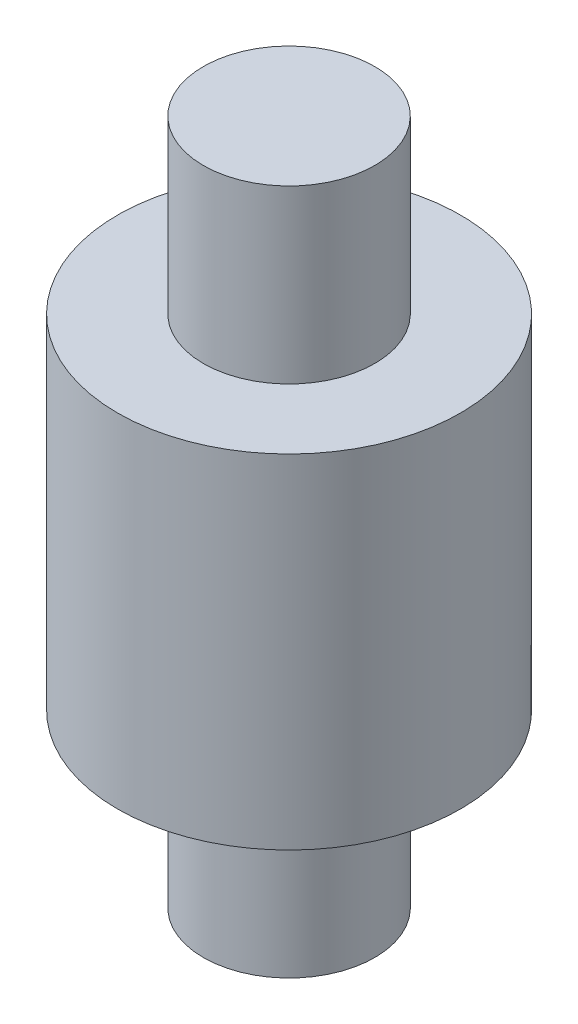
ISO-10303-21;
HEADER;
FILE_DESCRIPTION(('STEP AP214'),'2;1');
FILE_NAME('part.step','',(''),(''),'','','');
FILE_SCHEMA(('AUTOMOTIVE_DESIGN { 1 0 10303 214 1 1 1 1 }'));
ENDSEC;
DATA;
#1=APPLICATION_CONTEXT('core data for automotive mechanical design processes');
#2=APPLICATION_PROTOCOL_DEFINITION('international standard','automotive_design',2000,#1);
#3=PRODUCT_CONTEXT('',#1,'mechanical');
#4=PRODUCT('Part','Part','',(#3));
#5=PRODUCT_RELATED_PRODUCT_CATEGORY('part','',(#4));
#6=PRODUCT_DEFINITION_FORMATION('','',#4);
#7=PRODUCT_DEFINITION_CONTEXT('part definition',#1,'design');
#8=PRODUCT_DEFINITION('design','',#6,#7);
#9=PRODUCT_DEFINITION_SHAPE('','',#8);
#10=(LENGTH_UNIT() NAMED_UNIT(*) SI_UNIT(.MILLI.,.METRE.));
#11=(NAMED_UNIT(*) PLANE_ANGLE_UNIT() SI_UNIT($,.RADIAN.));
#12=(NAMED_UNIT(*) SI_UNIT($,.STERADIAN.) SOLID_ANGLE_UNIT());
#13=UNCERTAINTY_MEASURE_WITH_UNIT(LENGTH_MEASURE(1.E-05),#10,'distance_accuracy_value','');
#14=(GEOMETRIC_REPRESENTATION_CONTEXT(3) GLOBAL_UNCERTAINTY_ASSIGNED_CONTEXT((#13)) GLOBAL_UNIT_ASSIGNED_CONTEXT((#10,
#11,#12)) REPRESENTATION_CONTEXT('',''));
#15=CARTESIAN_POINT('',(0.,0.,0.));
#16=DIRECTION('',(0.,0.,1.));
#17=DIRECTION('',(1.,0.,0.));
#18=AXIS2_PLACEMENT_3D('',#15,#16,#17);
#19=CARTESIAN_POINT('',(0.,2.,0.));
#20=DIRECTION('',(0.,-1.,0.));
#21=DIRECTION('',(0.,0.,-1.));
#22=AXIS2_PLACEMENT_3D('',#19,#20,#21);
#23=CYLINDRICAL_SURFACE('',#22,1.);
#24=CARTESIAN_POINT('',(0.,2.,0.));
#25=DIRECTION('',(0.,1.,0.));
#26=DIRECTION('',(0.,0.,1.));
#27=AXIS2_PLACEMENT_3D('',#24,#25,#26);
#28=CIRCLE('',#27,1.);
#29=CARTESIAN_POINT('',(0.,2.,1.));
#30=VERTEX_POINT('',#29);
#31=EDGE_CURVE('E39',#30,#30,#28,.T.);
#32=ORIENTED_EDGE('',*,*,#31,.F.);
#33=EDGE_LOOP('',(#32));
#34=FACE_BOUND('',#33,.T.);
#35=CARTESIAN_POINT('',(0.,0.,0.));
#36=DIRECTION('',(0.,1.,0.));
#37=DIRECTION('',(0.,0.,1.));
#38=AXIS2_PLACEMENT_3D('',#35,#36,#37);
#39=CIRCLE('',#38,1.);
#40=CARTESIAN_POINT('',(0.,0.,1.));
#41=VERTEX_POINT('',#40);
#42=EDGE_CURVE('E35',#41,#41,#39,.T.);
#43=ORIENTED_EDGE('',*,*,#42,.T.);
#44=EDGE_LOOP('',(#43));
#45=FACE_BOUND('',#44,.T.);
#46=ADVANCED_FACE('F32',(#34,#45),#23,.T.);
#47=CARTESIAN_POINT('',(0.,0.,0.));
#48=DIRECTION('',(0.,1.,0.));
#49=DIRECTION('',(0.,0.,1.));
#50=AXIS2_PLACEMENT_3D('',#47,#48,#49);
#51=PLANE('',#50);
#52=ORIENTED_EDGE('',*,*,#42,.F.);
#53=EDGE_LOOP('',(#52));
#54=FACE_BOUND('',#53,.T.);
#55=ADVANCED_FACE('F73',(#54),#51,.F.);
#56=CARTESIAN_POINT('',(0.,6.,0.));
#57=DIRECTION('',(0.,-1.,0.));
#58=DIRECTION('',(0.,0.,-1.));
#59=AXIS2_PLACEMENT_3D('',#56,#57,#58);
#60=CYLINDRICAL_SURFACE('',#59,2.);
#61=CARTESIAN_POINT('',(0.,6.,0.));
#62=DIRECTION('',(0.,1.,0.));
#63=DIRECTION('',(0.,0.,1.));
#64=AXIS2_PLACEMENT_3D('',#61,#62,#63);
#65=CIRCLE('',#64,2.);
#66=CARTESIAN_POINT('',(0.,6.,2.));
#67=VERTEX_POINT('',#66);
#68=EDGE_CURVE('E47',#67,#67,#65,.T.);
#69=ORIENTED_EDGE('',*,*,#68,.F.);
#70=EDGE_LOOP('',(#69));
#71=FACE_BOUND('',#70,.T.);
#72=CARTESIAN_POINT('',(0.,2.,0.));
#73=DIRECTION('',(0.,1.,0.));
#74=DIRECTION('',(0.,0.,1.));
#75=AXIS2_PLACEMENT_3D('',#72,#73,#74);
#76=CIRCLE('',#75,2.);
#77=CARTESIAN_POINT('',(0.,2.,2.));
#78=VERTEX_POINT('',#77);
#79=EDGE_CURVE('E50',#78,#78,#76,.T.);
#80=ORIENTED_EDGE('',*,*,#79,.T.);
#81=EDGE_LOOP('',(#80));
#82=FACE_BOUND('',#81,.T.);
#83=ADVANCED_FACE('F78',(#71,#82),#60,.T.);
#84=CARTESIAN_POINT('',(0.,6.,0.));
#85=DIRECTION('',(0.,1.,0.));
#86=DIRECTION('',(0.,0.,1.));
#87=AXIS2_PLACEMENT_3D('',#84,#85,#86);
#88=PLANE('',#87);
#89=CARTESIAN_POINT('',(0.,6.,0.));
#90=DIRECTION('',(0.,1.,0.));
#91=DIRECTION('',(0.,0.,1.));
#92=AXIS2_PLACEMENT_3D('',#89,#90,#91);
#93=CIRCLE('',#92,1.);
#94=CARTESIAN_POINT('',(0.,6.,1.));
#95=VERTEX_POINT('',#94);
#96=EDGE_CURVE('E10',#95,#95,#93,.T.);
#97=ORIENTED_EDGE('',*,*,#96,.F.);
#98=EDGE_LOOP('',(#97));
#99=FACE_BOUND('',#98,.T.);
#100=ORIENTED_EDGE('',*,*,#68,.T.);
#101=EDGE_LOOP('',(#100));
#102=FACE_BOUND('',#101,.T.);
#103=ADVANCED_FACE('F68',(#99,#102),#88,.T.);
#104=CARTESIAN_POINT('',(0.,2.,0.));
#105=DIRECTION('',(0.,1.,0.));
#106=DIRECTION('',(0.,0.,1.));
#107=AXIS2_PLACEMENT_3D('',#104,#105,#106);
#108=PLANE('',#107);
#109=ORIENTED_EDGE('',*,*,#31,.T.);
#110=EDGE_LOOP('',(#109));
#111=FACE_BOUND('',#110,.T.);
#112=ORIENTED_EDGE('',*,*,#79,.F.);
#113=EDGE_LOOP('',(#112));
#114=FACE_BOUND('',#113,.T.);
#115=ADVANCED_FACE('F61',(#111,#114),#108,.F.);
#116=CARTESIAN_POINT('',(0.,8.,0.));
#117=DIRECTION('',(0.,-1.,0.));
#118=DIRECTION('',(0.,0.,-1.));
#119=AXIS2_PLACEMENT_3D('',#116,#117,#118);
#120=CYLINDRICAL_SURFACE('',#119,1.);
#121=CARTESIAN_POINT('',(0.,8.,0.));
#122=DIRECTION('',(0.,1.,0.));
#123=DIRECTION('',(0.,0.,1.));
#124=AXIS2_PLACEMENT_3D('',#121,#122,#123);
#125=CIRCLE('',#124,1.);
#126=CARTESIAN_POINT('',(0.,8.,1.));
#127=VERTEX_POINT('',#126);
#128=EDGE_CURVE('E46',#127,#127,#125,.T.);
#129=ORIENTED_EDGE('',*,*,#128,.F.);
#130=EDGE_LOOP('',(#129));
#131=FACE_BOUND('',#130,.T.);
#132=ORIENTED_EDGE('',*,*,#96,.T.);
#133=EDGE_LOOP('',(#132));
#134=FACE_BOUND('',#133,.T.);
#135=ADVANCED_FACE('F59',(#131,#134),#120,.T.);
#136=CARTESIAN_POINT('',(0.,8.,0.));
#137=DIRECTION('',(0.,1.,0.));
#138=DIRECTION('',(0.,0.,1.));
#139=AXIS2_PLACEMENT_3D('',#136,#137,#138);
#140=PLANE('',#139);
#141=ORIENTED_EDGE('',*,*,#128,.T.);
#142=EDGE_LOOP('',(#141));
#143=FACE_BOUND('',#142,.T.);
#144=ADVANCED_FACE('F57',(#143),#140,.T.);
#145=CLOSED_SHELL('',(#46,#55,#83,#103,#115,#135,#144));
#146=MANIFOLD_SOLID_BREP('B2',#145);
#147=ADVANCED_BREP_SHAPE_REPRESENTATION('',(#18,#146),#14);
#148=SHAPE_DEFINITION_REPRESENTATION(#9,#147);
ENDSEC;
END-ISO-10303-21;
